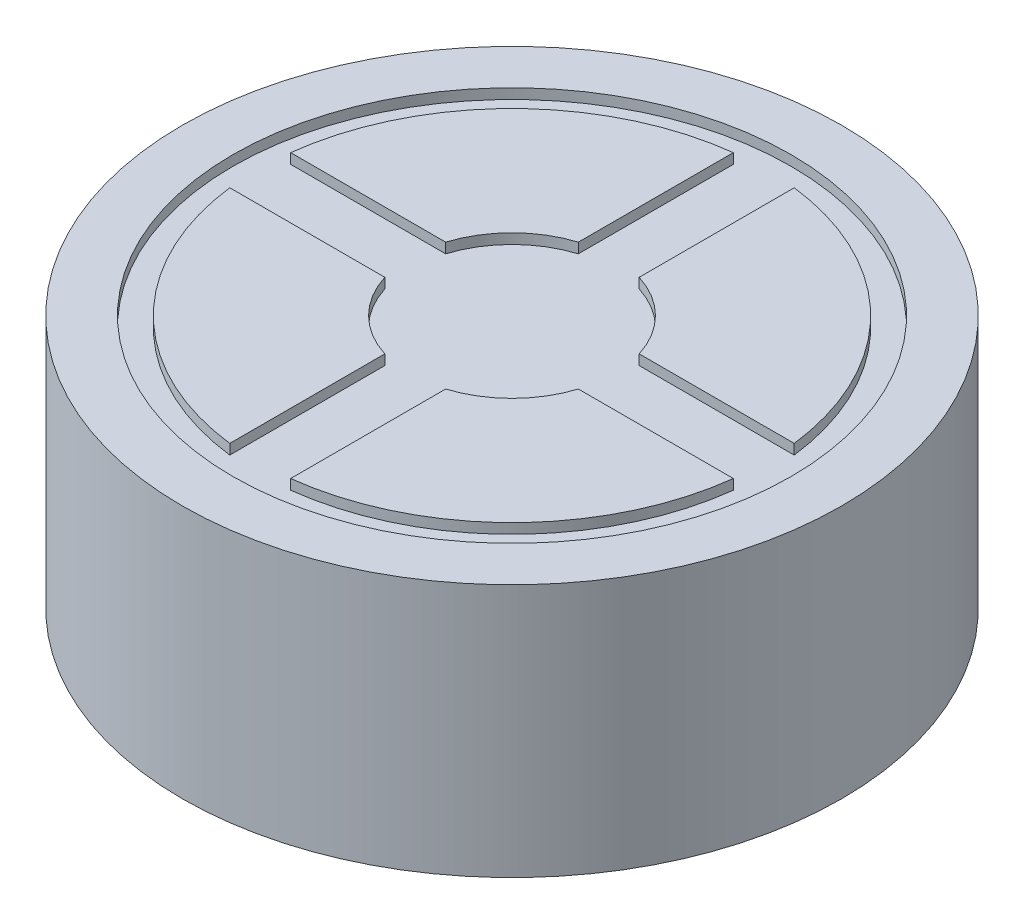
ISO-10303-21;
HEADER;
FILE_DESCRIPTION(('STEP AP214'),'2;1');
FILE_NAME('part.step','',(''),(''),'','','');
FILE_SCHEMA(('AUTOMOTIVE_DESIGN { 1 0 10303 214 1 1 1 1 }'));
ENDSEC;
DATA;
#1=APPLICATION_CONTEXT('core data for automotive mechanical design processes');
#2=APPLICATION_PROTOCOL_DEFINITION('international standard','automotive_design',2000,#1);
#3=PRODUCT_CONTEXT('',#1,'mechanical');
#4=PRODUCT('Part','Part','',(#3));
#5=PRODUCT_RELATED_PRODUCT_CATEGORY('part','',(#4));
#6=PRODUCT_DEFINITION_FORMATION('','',#4);
#7=PRODUCT_DEFINITION_CONTEXT('part definition',#1,'design');
#8=PRODUCT_DEFINITION('design','',#6,#7);
#9=PRODUCT_DEFINITION_SHAPE('','',#8);
#10=(LENGTH_UNIT() NAMED_UNIT(*) SI_UNIT(.MILLI.,.METRE.));
#11=(NAMED_UNIT(*) PLANE_ANGLE_UNIT() SI_UNIT($,.RADIAN.));
#12=(NAMED_UNIT(*) SI_UNIT($,.STERADIAN.) SOLID_ANGLE_UNIT());
#13=UNCERTAINTY_MEASURE_WITH_UNIT(LENGTH_MEASURE(1.E-05),#10,'distance_accuracy_value','');
#14=(GEOMETRIC_REPRESENTATION_CONTEXT(3) GLOBAL_UNCERTAINTY_ASSIGNED_CONTEXT((#13)) GLOBAL_UNIT_ASSIGNED_CONTEXT((#10,
#11,#12)) REPRESENTATION_CONTEXT('',''));
#15=CARTESIAN_POINT('',(0.,0.,0.));
#16=DIRECTION('',(0.,0.,1.));
#17=DIRECTION('',(1.,0.,0.));
#18=AXIS2_PLACEMENT_3D('',#15,#16,#17);
#19=CARTESIAN_POINT('',(0.,5.,0.));
#20=DIRECTION('',(0.,-1.,0.));
#21=DIRECTION('',(0.,0.,-1.));
#22=AXIS2_PLACEMENT_3D('',#19,#20,#21);
#23=CYLINDRICAL_SURFACE('',#22,5.);
#24=CARTESIAN_POINT('',(0.,5.,0.));
#25=DIRECTION('',(0.,1.,0.));
#26=DIRECTION('',(0.,0.,1.));
#27=AXIS2_PLACEMENT_3D('',#24,#25,#26);
#28=CIRCLE('',#27,5.);
#29=CARTESIAN_POINT('',(0.,5.,5.));
#30=VERTEX_POINT('',#29);
#31=EDGE_CURVE('E11',#30,#30,#28,.T.);
#32=ORIENTED_EDGE('',*,*,#31,.F.);
#33=EDGE_LOOP('',(#32));
#34=FACE_BOUND('',#33,.T.);
#35=CARTESIAN_POINT('',(0.,0.,0.));
#36=DIRECTION('',(0.,1.,0.));
#37=DIRECTION('',(0.,0.,1.));
#38=AXIS2_PLACEMENT_3D('',#35,#36,#37);
#39=CIRCLE('',#38,5.);
#40=CARTESIAN_POINT('',(0.,0.,5.));
#41=VERTEX_POINT('',#40);
#42=EDGE_CURVE('E37',#41,#41,#39,.T.);
#43=ORIENTED_EDGE('',*,*,#42,.T.);
#44=EDGE_LOOP('',(#43));
#45=FACE_BOUND('',#44,.T.);
#46=ADVANCED_FACE('F34',(#34,#45),#23,.T.);
#47=CARTESIAN_POINT('',(0.,0.,0.));
#48=DIRECTION('',(0.,1.,0.));
#49=DIRECTION('',(0.,0.,1.));
#50=AXIS2_PLACEMENT_3D('',#47,#48,#49);
#51=PLANE('',#50);
#52=ORIENTED_EDGE('',*,*,#42,.F.);
#53=EDGE_LOOP('',(#52));
#54=FACE_BOUND('',#53,.T.);
#55=ADVANCED_FACE('F318',(#54),#51,.F.);
#56=CARTESIAN_POINT('',(0.,30.,0.));
#57=DIRECTION('',(0.,-1.,0.));
#58=DIRECTION('',(0.,0.,-1.));
#59=AXIS2_PLACEMENT_3D('',#56,#57,#58);
#60=CYLINDRICAL_SURFACE('',#59,32.5);
#61=CARTESIAN_POINT('',(0.,30.,0.));
#62=DIRECTION('',(0.,1.,0.));
#63=DIRECTION('',(0.,0.,1.));
#64=AXIS2_PLACEMENT_3D('',#61,#62,#63);
#65=CIRCLE('',#64,32.5);
#66=CARTESIAN_POINT('',(0.,30.,32.5));
#67=VERTEX_POINT('',#66);
#68=EDGE_CURVE('E292',#67,#67,#65,.T.);
#69=ORIENTED_EDGE('',*,*,#68,.F.);
#70=EDGE_LOOP('',(#69));
#71=FACE_BOUND('',#70,.T.);
#72=CARTESIAN_POINT('',(0.,5.,0.));
#73=DIRECTION('',(0.,1.,0.));
#74=DIRECTION('',(0.,0.,1.));
#75=AXIS2_PLACEMENT_3D('',#72,#73,#74);
#76=CIRCLE('',#75,32.5);
#77=CARTESIAN_POINT('',(0.,5.,32.5));
#78=VERTEX_POINT('',#77);
#79=EDGE_CURVE('E289',#78,#78,#76,.T.);
#80=ORIENTED_EDGE('',*,*,#79,.T.);
#81=EDGE_LOOP('',(#80));
#82=FACE_BOUND('',#81,.T.);
#83=ADVANCED_FACE('F298',(#71,#82),#60,.T.);
#84=CARTESIAN_POINT('',(0.,30.,0.));
#85=DIRECTION('',(0.,1.,0.));
#86=DIRECTION('',(0.,0.,1.));
#87=AXIS2_PLACEMENT_3D('',#84,#85,#86);
#88=PLANE('',#87);
#89=CARTESIAN_POINT('',(0.,30.,0.));
#90=DIRECTION('',(0.,1.,0.));
#91=DIRECTION('',(0.,0.,1.));
#92=AXIS2_PLACEMENT_3D('',#89,#90,#91);
#93=CIRCLE('',#92,27.5);
#94=CARTESIAN_POINT('',(0.,30.,27.5));
#95=VERTEX_POINT('',#94);
#96=EDGE_CURVE('E280',#95,#95,#93,.T.);
#97=ORIENTED_EDGE('',*,*,#96,.F.);
#98=EDGE_LOOP('',(#97));
#99=FACE_BOUND('',#98,.T.);
#100=ORIENTED_EDGE('',*,*,#68,.T.);
#101=EDGE_LOOP('',(#100));
#102=FACE_BOUND('',#101,.T.);
#103=ADVANCED_FACE('F303',(#99,#102),#88,.T.);
#104=CARTESIAN_POINT('',(0.,5.,0.));
#105=DIRECTION('',(0.,1.,0.));
#106=DIRECTION('',(0.,0.,1.));
#107=AXIS2_PLACEMENT_3D('',#104,#105,#106);
#108=PLANE('',#107);
#109=ORIENTED_EDGE('',*,*,#31,.T.);
#110=EDGE_LOOP('',(#109));
#111=FACE_BOUND('',#110,.T.);
#112=ORIENTED_EDGE('',*,*,#79,.F.);
#113=EDGE_LOOP('',(#112));
#114=FACE_BOUND('',#113,.T.);
#115=ADVANCED_FACE('F300',(#111,#114),#108,.F.);
#116=CARTESIAN_POINT('',(0.,29.,0.));
#117=DIRECTION('',(0.,1.,0.));
#118=DIRECTION('',(0.,0.,1.));
#119=AXIS2_PLACEMENT_3D('',#116,#117,#118);
#120=CYLINDRICAL_SURFACE('',#119,27.5);
#121=CARTESIAN_POINT('',(0.,29.,0.));
#122=DIRECTION('',(0.,1.,0.));
#123=DIRECTION('',(0.,0.,1.));
#124=AXIS2_PLACEMENT_3D('',#121,#122,#123);
#125=CIRCLE('',#124,27.5);
#126=CARTESIAN_POINT('',(0.,29.,27.5));
#127=VERTEX_POINT('',#126);
#128=EDGE_CURVE('E286',#127,#127,#125,.T.);
#129=ORIENTED_EDGE('',*,*,#128,.F.);
#130=EDGE_LOOP('',(#129));
#131=FACE_BOUND('',#130,.T.);
#132=ORIENTED_EDGE('',*,*,#96,.T.);
#133=EDGE_LOOP('',(#132));
#134=FACE_BOUND('',#133,.T.);
#135=ADVANCED_FACE('F302',(#131,#134),#120,.F.);
#136=CARTESIAN_POINT('',(0.,29.,0.));
#137=DIRECTION('',(0.,1.,0.));
#138=DIRECTION('',(0.,0.,1.));
#139=AXIS2_PLACEMENT_3D('',#136,#137,#138);
#140=PLANE('',#139);
#141=DIRECTION('',(1.,0.,0.));
#142=VECTOR('',#141,1.);
#143=CARTESIAN_POINT('',(9.53939201416946,29.,-3.));
#144=LINE('',#143,#142);
#145=CARTESIAN_POINT('',(9.53939201416945,29.,-3.));
#146=VERTEX_POINT('',#145);
#147=CARTESIAN_POINT('',(24.8193472919817,29.,-3.));
#148=VERTEX_POINT('',#147);
#149=EDGE_CURVE('E160',#146,#148,#144,.T.);
#150=ORIENTED_EDGE('',*,*,#149,.F.);
#151=CARTESIAN_POINT('',(0.,29.,0.));
#152=DIRECTION('',(0.,-1.,0.));
#153=DIRECTION('',(0.,0.,1.));
#154=AXIS2_PLACEMENT_3D('',#151,#152,#153);
#155=CIRCLE('',#154,10.);
#156=CARTESIAN_POINT('',(3.,29.,-9.53939201416946));
#157=VERTEX_POINT('',#156);
#158=EDGE_CURVE('E170',#157,#146,#155,.T.);
#159=ORIENTED_EDGE('',*,*,#158,.F.);
#160=DIRECTION('',(0.,0.,1.));
#161=VECTOR('',#160,1.);
#162=CARTESIAN_POINT('',(3.,29.,-24.8193472919817));
#163=LINE('',#162,#161);
#164=CARTESIAN_POINT('',(3.,29.,-24.8193472919817));
#165=VERTEX_POINT('',#164);
#166=EDGE_CURVE('E152',#165,#157,#163,.T.);
#167=ORIENTED_EDGE('',*,*,#166,.F.);
#168=CARTESIAN_POINT('',(0.,29.,0.));
#169=DIRECTION('',(0.,1.,0.));
#170=DIRECTION('',(0.,0.,1.));
#171=AXIS2_PLACEMENT_3D('',#168,#169,#170);
#172=CIRCLE('',#171,25.);
#173=EDGE_CURVE('E167',#148,#165,#172,.T.);
#174=ORIENTED_EDGE('',*,*,#173,.F.);
#175=EDGE_LOOP('',(#150,#159,#167,#174));
#176=FACE_BOUND('',#175,.T.);
#177=DIRECTION('',(0.,0.,1.));
#178=VECTOR('',#177,1.);
#179=CARTESIAN_POINT('',(3.,29.,9.53939201416946));
#180=LINE('',#179,#178);
#181=CARTESIAN_POINT('',(3.,29.,9.53939201416946));
#182=VERTEX_POINT('',#181);
#183=CARTESIAN_POINT('',(3.,29.,24.8193472919817));
#184=VERTEX_POINT('',#183);
#185=EDGE_CURVE('E203',#182,#184,#180,.T.);
#186=ORIENTED_EDGE('',*,*,#185,.F.);
#187=CARTESIAN_POINT('',(0.,29.,0.));
#188=DIRECTION('',(0.,-1.,0.));
#189=DIRECTION('',(0.,0.,1.));
#190=AXIS2_PLACEMENT_3D('',#187,#188,#189);
#191=CIRCLE('',#190,10.);
#192=CARTESIAN_POINT('',(9.53939201416946,29.,3.));
#193=VERTEX_POINT('',#192);
#194=EDGE_CURVE('E200',#193,#182,#191,.T.);
#195=ORIENTED_EDGE('',*,*,#194,.F.);
#196=DIRECTION('',(-1.,0.,0.));
#197=VECTOR('',#196,1.);
#198=CARTESIAN_POINT('',(9.53939201416946,29.,3.));
#199=LINE('',#198,#197);
#200=CARTESIAN_POINT('',(24.8193472919817,29.,3.));
#201=VERTEX_POINT('',#200);
#202=EDGE_CURVE('E196',#201,#193,#199,.T.);
#203=ORIENTED_EDGE('',*,*,#202,.F.);
#204=CARTESIAN_POINT('',(0.,29.,0.));
#205=DIRECTION('',(0.,1.,0.));
#206=DIRECTION('',(0.,0.,1.));
#207=AXIS2_PLACEMENT_3D('',#204,#205,#206);
#208=CIRCLE('',#207,25.);
#209=EDGE_CURVE('E193',#184,#201,#208,.T.);
#210=ORIENTED_EDGE('',*,*,#209,.F.);
#211=EDGE_LOOP('',(#186,#195,#203,#210));
#212=FACE_BOUND('',#211,.T.);
#213=DIRECTION('',(0.,0.,-1.));
#214=VECTOR('',#213,1.);
#215=CARTESIAN_POINT('',(-3.,29.,-24.8193472919817));
#216=LINE('',#215,#214);
#217=CARTESIAN_POINT('',(-3.,29.,-9.53939201416946));
#218=VERTEX_POINT('',#217);
#219=CARTESIAN_POINT('',(-3.,29.,-24.8193472919817));
#220=VERTEX_POINT('',#219);
#221=EDGE_CURVE('E236',#218,#220,#216,.T.);
#222=ORIENTED_EDGE('',*,*,#221,.F.);
#223=CARTESIAN_POINT('',(0.,29.,0.));
#224=DIRECTION('',(0.,-1.,0.));
#225=DIRECTION('',(0.,0.,1.));
#226=AXIS2_PLACEMENT_3D('',#223,#224,#225);
#227=CIRCLE('',#226,10.);
#228=CARTESIAN_POINT('',(-9.53939201416946,29.,-3.));
#229=VERTEX_POINT('',#228);
#230=EDGE_CURVE('E233',#229,#218,#227,.T.);
#231=ORIENTED_EDGE('',*,*,#230,.F.);
#232=DIRECTION('',(1.,0.,0.));
#233=VECTOR('',#232,1.);
#234=CARTESIAN_POINT('',(-24.8193472919817,29.,-3.));
#235=LINE('',#234,#233);
#236=CARTESIAN_POINT('',(-24.8193472919817,29.,-3.));
#237=VERTEX_POINT('',#236);
#238=EDGE_CURVE('E229',#237,#229,#235,.T.);
#239=ORIENTED_EDGE('',*,*,#238,.F.);
#240=CARTESIAN_POINT('',(0.,29.,0.));
#241=DIRECTION('',(0.,1.,0.));
#242=DIRECTION('',(0.,0.,1.));
#243=AXIS2_PLACEMENT_3D('',#240,#241,#242);
#244=CIRCLE('',#243,25.);
#245=EDGE_CURVE('E226',#220,#237,#244,.T.);
#246=ORIENTED_EDGE('',*,*,#245,.F.);
#247=EDGE_LOOP('',(#222,#231,#239,#246));
#248=FACE_BOUND('',#247,.T.);
#249=DIRECTION('',(-1.,0.,0.));
#250=VECTOR('',#249,1.);
#251=CARTESIAN_POINT('',(-24.8193472919817,29.,3.));
#252=LINE('',#251,#250);
#253=CARTESIAN_POINT('',(-9.53939201416946,29.,3.));
#254=VERTEX_POINT('',#253);
#255=CARTESIAN_POINT('',(-24.8193472919817,29.,3.));
#256=VERTEX_POINT('',#255);
#257=EDGE_CURVE('E266',#254,#256,#252,.T.);
#258=ORIENTED_EDGE('',*,*,#257,.F.);
#259=CARTESIAN_POINT('',(0.,29.,0.));
#260=DIRECTION('',(0.,-1.,0.));
#261=DIRECTION('',(0.,0.,1.));
#262=AXIS2_PLACEMENT_3D('',#259,#260,#261);
#263=CIRCLE('',#262,10.);
#264=CARTESIAN_POINT('',(-3.,29.,9.53939201416945));
#265=VERTEX_POINT('',#264);
#266=EDGE_CURVE('E263',#265,#254,#263,.T.);
#267=ORIENTED_EDGE('',*,*,#266,.F.);
#268=DIRECTION('',(0.,0.,-1.));
#269=VECTOR('',#268,1.);
#270=CARTESIAN_POINT('',(-3.,29.,9.53939201416946));
#271=LINE('',#270,#269);
#272=CARTESIAN_POINT('',(-3.,29.,24.8193472919817));
#273=VERTEX_POINT('',#272);
#274=EDGE_CURVE('E259',#273,#265,#271,.T.);
#275=ORIENTED_EDGE('',*,*,#274,.F.);
#276=CARTESIAN_POINT('',(0.,29.,0.));
#277=DIRECTION('',(0.,1.,0.));
#278=DIRECTION('',(0.,0.,1.));
#279=AXIS2_PLACEMENT_3D('',#276,#277,#278);
#280=CIRCLE('',#279,25.);
#281=EDGE_CURVE('E256',#256,#273,#280,.T.);
#282=ORIENTED_EDGE('',*,*,#281,.F.);
#283=EDGE_LOOP('',(#258,#267,#275,#282));
#284=FACE_BOUND('',#283,.T.);
#285=ORIENTED_EDGE('',*,*,#128,.T.);
#286=EDGE_LOOP('',(#285));
#287=FACE_BOUND('',#286,.T.);
#288=ADVANCED_FACE('F165',(#176,#212,#248,#284,#287),#140,.T.);
#289=CARTESIAN_POINT('',(0.,29.,0.));
#290=DIRECTION('',(0.,1.,0.));
#291=DIRECTION('',(0.,0.,1.));
#292=AXIS2_PLACEMENT_3D('',#289,#290,#291);
#293=CYLINDRICAL_SURFACE('',#292,25.);
#294=CARTESIAN_POINT('',(0.,30.,0.));
#295=DIRECTION('',(0.,1.,0.));
#296=DIRECTION('',(0.,0.,1.));
#297=AXIS2_PLACEMENT_3D('',#294,#295,#296);
#298=CIRCLE('',#297,25.);
#299=CARTESIAN_POINT('',(-24.8193472919817,30.,3.));
#300=VERTEX_POINT('',#299);
#301=CARTESIAN_POINT('',(-3.,30.,24.8193472919817));
#302=VERTEX_POINT('',#301);
#303=EDGE_CURVE('E250',#300,#302,#298,.T.);
#304=ORIENTED_EDGE('',*,*,#303,.F.);
#305=DIRECTION('',(0.,1.,0.));
#306=VECTOR('',#305,1.);
#307=CARTESIAN_POINT('',(-24.8193472919817,29.,3.));
#308=LINE('',#307,#306);
#309=EDGE_CURVE('E278',#256,#300,#308,.T.);
#310=ORIENTED_EDGE('',*,*,#309,.F.);
#311=ORIENTED_EDGE('',*,*,#281,.T.);
#312=DIRECTION('',(0.,1.,0.));
#313=VECTOR('',#312,1.);
#314=CARTESIAN_POINT('',(-3.,29.,24.8193472919817));
#315=LINE('',#314,#313);
#316=EDGE_CURVE('E269',#273,#302,#315,.T.);
#317=ORIENTED_EDGE('',*,*,#316,.T.);
#318=EDGE_LOOP('',(#304,#310,#311,#317));
#319=FACE_BOUND('',#318,.T.);
#320=ADVANCED_FACE('F360',(#319),#293,.T.);
#321=CARTESIAN_POINT('',(-24.8193472919817,29.,3.));
#322=DIRECTION('',(0.,0.,-1.));
#323=DIRECTION('',(-1.,0.,0.));
#324=AXIS2_PLACEMENT_3D('',#321,#322,#323);
#325=PLANE('',#324);
#326=DIRECTION('',(-1.,0.,0.));
#327=VECTOR('',#326,1.);
#328=CARTESIAN_POINT('',(-24.8193472919817,30.,3.));
#329=LINE('',#328,#327);
#330=CARTESIAN_POINT('',(-9.53939201416946,30.,3.));
#331=VERTEX_POINT('',#330);
#332=EDGE_CURVE('E260',#331,#300,#329,.T.);
#333=ORIENTED_EDGE('',*,*,#332,.F.);
#334=DIRECTION('',(0.,1.,0.));
#335=VECTOR('',#334,1.);
#336=CARTESIAN_POINT('',(-9.53939201416946,29.,3.));
#337=LINE('',#336,#335);
#338=EDGE_CURVE('E281',#254,#331,#337,.T.);
#339=ORIENTED_EDGE('',*,*,#338,.F.);
#340=ORIENTED_EDGE('',*,*,#257,.T.);
#341=ORIENTED_EDGE('',*,*,#309,.T.);
#342=EDGE_LOOP('',(#333,#339,#340,#341));
#343=FACE_BOUND('',#342,.T.);
#344=ADVANCED_FACE('F369',(#343),#325,.T.);
#345=CARTESIAN_POINT('',(0.,29.,0.));
#346=DIRECTION('',(0.,1.,0.));
#347=DIRECTION('',(0.,0.,1.));
#348=AXIS2_PLACEMENT_3D('',#345,#346,#347);
#349=CYLINDRICAL_SURFACE('',#348,10.);
#350=CARTESIAN_POINT('',(0.,30.,0.));
#351=DIRECTION('',(0.,-1.,0.));
#352=DIRECTION('',(0.,0.,1.));
#353=AXIS2_PLACEMENT_3D('',#350,#351,#352);
#354=CIRCLE('',#353,10.);
#355=CARTESIAN_POINT('',(-3.,30.,9.53939201416945));
#356=VERTEX_POINT('',#355);
#357=EDGE_CURVE('E48',#356,#331,#354,.T.);
#358=ORIENTED_EDGE('',*,*,#357,.F.);
#359=DIRECTION('',(0.,1.,0.));
#360=VECTOR('',#359,1.);
#361=CARTESIAN_POINT('',(-3.,29.,9.53939201416945));
#362=LINE('',#361,#360);
#363=EDGE_CURVE('E283',#265,#356,#362,.T.);
#364=ORIENTED_EDGE('',*,*,#363,.F.);
#365=ORIENTED_EDGE('',*,*,#266,.T.);
#366=ORIENTED_EDGE('',*,*,#338,.T.);
#367=EDGE_LOOP('',(#358,#364,#365,#366));
#368=FACE_BOUND('',#367,.T.);
#369=ADVANCED_FACE('F379',(#368),#349,.F.);
#370=CARTESIAN_POINT('',(-3.,29.,9.53939201416946));
#371=DIRECTION('',(1.,0.,0.));
#372=DIRECTION('',(0.,0.,-1.));
#373=AXIS2_PLACEMENT_3D('',#370,#371,#372);
#374=PLANE('',#373);
#375=DIRECTION('',(0.,0.,-1.));
#376=VECTOR('',#375,1.);
#377=CARTESIAN_POINT('',(-3.,30.,9.53939201416946));
#378=LINE('',#377,#376);
#379=EDGE_CURVE('E272',#302,#356,#378,.T.);
#380=ORIENTED_EDGE('',*,*,#379,.F.);
#381=ORIENTED_EDGE('',*,*,#316,.F.);
#382=ORIENTED_EDGE('',*,*,#274,.T.);
#383=ORIENTED_EDGE('',*,*,#363,.T.);
#384=EDGE_LOOP('',(#380,#381,#382,#383));
#385=FACE_BOUND('',#384,.T.);
#386=ADVANCED_FACE('F389',(#385),#374,.T.);
#387=CARTESIAN_POINT('',(0.,29.,0.));
#388=DIRECTION('',(0.,1.,0.));
#389=DIRECTION('',(0.,0.,1.));
#390=AXIS2_PLACEMENT_3D('',#387,#388,#389);
#391=CYLINDRICAL_SURFACE('',#390,25.);
#392=CARTESIAN_POINT('',(0.,30.,0.));
#393=DIRECTION('',(0.,1.,0.));
#394=DIRECTION('',(0.,0.,1.));
#395=AXIS2_PLACEMENT_3D('',#392,#393,#394);
#396=CIRCLE('',#395,25.);
#397=CARTESIAN_POINT('',(-3.,30.,-24.8193472919817));
#398=VERTEX_POINT('',#397);
#399=CARTESIAN_POINT('',(-24.8193472919817,30.,-3.));
#400=VERTEX_POINT('',#399);
#401=EDGE_CURVE('E219',#398,#400,#396,.T.);
#402=ORIENTED_EDGE('',*,*,#401,.F.);
#403=DIRECTION('',(0.,1.,0.));
#404=VECTOR('',#403,1.);
#405=CARTESIAN_POINT('',(-3.,29.,-24.8193472919817));
#406=LINE('',#405,#404);
#407=EDGE_CURVE('E248',#220,#398,#406,.T.);
#408=ORIENTED_EDGE('',*,*,#407,.F.);
#409=ORIENTED_EDGE('',*,*,#245,.T.);
#410=DIRECTION('',(0.,1.,0.));
#411=VECTOR('',#410,1.);
#412=CARTESIAN_POINT('',(-24.8193472919817,29.,-3.));
#413=LINE('',#412,#411);
#414=EDGE_CURVE('E239',#237,#400,#413,.T.);
#415=ORIENTED_EDGE('',*,*,#414,.T.);
#416=EDGE_LOOP('',(#402,#408,#409,#415));
#417=FACE_BOUND('',#416,.T.);
#418=ADVANCED_FACE('F398',(#417),#391,.T.);
#419=CARTESIAN_POINT('',(-3.,29.,-24.8193472919817));
#420=DIRECTION('',(1.,0.,0.));
#421=DIRECTION('',(0.,0.,-1.));
#422=AXIS2_PLACEMENT_3D('',#419,#420,#421);
#423=PLANE('',#422);
#424=DIRECTION('',(0.,0.,-1.));
#425=VECTOR('',#424,1.);
#426=CARTESIAN_POINT('',(-3.,30.,-24.8193472919817));
#427=LINE('',#426,#425);
#428=CARTESIAN_POINT('',(-3.,30.,-9.53939201416946));
#429=VERTEX_POINT('',#428);
#430=EDGE_CURVE('E230',#429,#398,#427,.T.);
#431=ORIENTED_EDGE('',*,*,#430,.F.);
#432=DIRECTION('',(0.,1.,0.));
#433=VECTOR('',#432,1.);
#434=CARTESIAN_POINT('',(-3.,29.,-9.53939201416946));
#435=LINE('',#434,#433);
#436=EDGE_CURVE('E251',#218,#429,#435,.T.);
#437=ORIENTED_EDGE('',*,*,#436,.F.);
#438=ORIENTED_EDGE('',*,*,#221,.T.);
#439=ORIENTED_EDGE('',*,*,#407,.T.);
#440=EDGE_LOOP('',(#431,#437,#438,#439));
#441=FACE_BOUND('',#440,.T.);
#442=ADVANCED_FACE('F408',(#441),#423,.T.);
#443=CARTESIAN_POINT('',(0.,29.,0.));
#444=DIRECTION('',(0.,1.,0.));
#445=DIRECTION('',(0.,0.,1.));
#446=AXIS2_PLACEMENT_3D('',#443,#444,#445);
#447=CYLINDRICAL_SURFACE('',#446,10.);
#448=CARTESIAN_POINT('',(0.,30.,0.));
#449=DIRECTION('',(0.,-1.,0.));
#450=DIRECTION('',(0.,0.,1.));
#451=AXIS2_PLACEMENT_3D('',#448,#449,#450);
#452=CIRCLE('',#451,10.);
#453=CARTESIAN_POINT('',(-9.53939201416946,30.,-3.));
#454=VERTEX_POINT('',#453);
#455=EDGE_CURVE('E56',#454,#429,#452,.T.);
#456=ORIENTED_EDGE('',*,*,#455,.F.);
#457=DIRECTION('',(0.,1.,0.));
#458=VECTOR('',#457,1.);
#459=CARTESIAN_POINT('',(-9.53939201416946,29.,-3.));
#460=LINE('',#459,#458);
#461=EDGE_CURVE('E253',#229,#454,#460,.T.);
#462=ORIENTED_EDGE('',*,*,#461,.F.);
#463=ORIENTED_EDGE('',*,*,#230,.T.);
#464=ORIENTED_EDGE('',*,*,#436,.T.);
#465=EDGE_LOOP('',(#456,#462,#463,#464));
#466=FACE_BOUND('',#465,.T.);
#467=ADVANCED_FACE('F418',(#466),#447,.F.);
#468=CARTESIAN_POINT('',(-24.8193472919817,29.,-3.));
#469=DIRECTION('',(0.,0.,1.));
#470=DIRECTION('',(1.,0.,0.));
#471=AXIS2_PLACEMENT_3D('',#468,#469,#470);
#472=PLANE('',#471);
#473=DIRECTION('',(1.,0.,0.));
#474=VECTOR('',#473,1.);
#475=CARTESIAN_POINT('',(-24.8193472919817,30.,-3.));
#476=LINE('',#475,#474);
#477=EDGE_CURVE('E242',#400,#454,#476,.T.);
#478=ORIENTED_EDGE('',*,*,#477,.F.);
#479=ORIENTED_EDGE('',*,*,#414,.F.);
#480=ORIENTED_EDGE('',*,*,#238,.T.);
#481=ORIENTED_EDGE('',*,*,#461,.T.);
#482=EDGE_LOOP('',(#478,#479,#480,#481));
#483=FACE_BOUND('',#482,.T.);
#484=ADVANCED_FACE('F428',(#483),#472,.T.);
#485=CARTESIAN_POINT('',(0.,29.,0.));
#486=DIRECTION('',(0.,1.,0.));
#487=DIRECTION('',(0.,0.,1.));
#488=AXIS2_PLACEMENT_3D('',#485,#486,#487);
#489=CYLINDRICAL_SURFACE('',#488,25.);
#490=CARTESIAN_POINT('',(0.,30.,0.));
#491=DIRECTION('',(0.,1.,0.));
#492=DIRECTION('',(0.,0.,1.));
#493=AXIS2_PLACEMENT_3D('',#490,#491,#492);
#494=CIRCLE('',#493,25.);
#495=CARTESIAN_POINT('',(3.,30.,24.8193472919817));
#496=VERTEX_POINT('',#495);
#497=CARTESIAN_POINT('',(24.8193472919817,30.,3.));
#498=VERTEX_POINT('',#497);
#499=EDGE_CURVE('E189',#496,#498,#494,.T.);
#500=ORIENTED_EDGE('',*,*,#499,.F.);
#501=DIRECTION('',(0.,1.,0.));
#502=VECTOR('',#501,1.);
#503=CARTESIAN_POINT('',(3.,29.,24.8193472919817));
#504=LINE('',#503,#502);
#505=EDGE_CURVE('E217',#184,#496,#504,.T.);
#506=ORIENTED_EDGE('',*,*,#505,.F.);
#507=ORIENTED_EDGE('',*,*,#209,.T.);
#508=DIRECTION('',(0.,1.,0.));
#509=VECTOR('',#508,1.);
#510=CARTESIAN_POINT('',(24.8193472919817,29.,3.));
#511=LINE('',#510,#509);
#512=EDGE_CURVE('E206',#201,#498,#511,.T.);
#513=ORIENTED_EDGE('',*,*,#512,.T.);
#514=EDGE_LOOP('',(#500,#506,#507,#513));
#515=FACE_BOUND('',#514,.T.);
#516=ADVANCED_FACE('F437',(#515),#489,.T.);
#517=CARTESIAN_POINT('',(3.,29.,9.53939201416946));
#518=DIRECTION('',(-1.,0.,0.));
#519=DIRECTION('',(0.,0.,1.));
#520=AXIS2_PLACEMENT_3D('',#517,#518,#519);
#521=PLANE('',#520);
#522=DIRECTION('',(0.,0.,1.));
#523=VECTOR('',#522,1.);
#524=CARTESIAN_POINT('',(3.,30.,9.53939201416946));
#525=LINE('',#524,#523);
#526=CARTESIAN_POINT('',(3.,30.,9.53939201416946));
#527=VERTEX_POINT('',#526);
#528=EDGE_CURVE('E197',#527,#496,#525,.T.);
#529=ORIENTED_EDGE('',*,*,#528,.F.);
#530=DIRECTION('',(0.,1.,0.));
#531=VECTOR('',#530,1.);
#532=CARTESIAN_POINT('',(3.,29.,9.53939201416946));
#533=LINE('',#532,#531);
#534=EDGE_CURVE('E220',#182,#527,#533,.T.);
#535=ORIENTED_EDGE('',*,*,#534,.F.);
#536=ORIENTED_EDGE('',*,*,#185,.T.);
#537=ORIENTED_EDGE('',*,*,#505,.T.);
#538=EDGE_LOOP('',(#529,#535,#536,#537));
#539=FACE_BOUND('',#538,.T.);
#540=ADVANCED_FACE('F447',(#539),#521,.T.);
#541=CARTESIAN_POINT('',(0.,29.,0.));
#542=DIRECTION('',(0.,1.,0.));
#543=DIRECTION('',(0.,0.,1.));
#544=AXIS2_PLACEMENT_3D('',#541,#542,#543);
#545=CYLINDRICAL_SURFACE('',#544,10.);
#546=CARTESIAN_POINT('',(0.,30.,0.));
#547=DIRECTION('',(0.,-1.,0.));
#548=DIRECTION('',(0.,0.,1.));
#549=AXIS2_PLACEMENT_3D('',#546,#547,#548);
#550=CIRCLE('',#549,10.);
#551=CARTESIAN_POINT('',(9.53939201416946,30.,3.));
#552=VERTEX_POINT('',#551);
#553=EDGE_CURVE('E212',#552,#527,#550,.T.);
#554=ORIENTED_EDGE('',*,*,#553,.F.);
#555=DIRECTION('',(0.,1.,0.));
#556=VECTOR('',#555,1.);
#557=CARTESIAN_POINT('',(9.53939201416946,29.,3.));
#558=LINE('',#557,#556);
#559=EDGE_CURVE('E222',#193,#552,#558,.T.);
#560=ORIENTED_EDGE('',*,*,#559,.F.);
#561=ORIENTED_EDGE('',*,*,#194,.T.);
#562=ORIENTED_EDGE('',*,*,#534,.T.);
#563=EDGE_LOOP('',(#554,#560,#561,#562));
#564=FACE_BOUND('',#563,.T.);
#565=ADVANCED_FACE('F457',(#564),#545,.F.);
#566=CARTESIAN_POINT('',(9.53939201416946,29.,3.));
#567=DIRECTION('',(0.,0.,-1.));
#568=DIRECTION('',(-1.,0.,0.));
#569=AXIS2_PLACEMENT_3D('',#566,#567,#568);
#570=PLANE('',#569);
#571=DIRECTION('',(-1.,0.,0.));
#572=VECTOR('',#571,1.);
#573=CARTESIAN_POINT('',(9.53939201416946,30.,3.));
#574=LINE('',#573,#572);
#575=EDGE_CURVE('E209',#498,#552,#574,.T.);
#576=ORIENTED_EDGE('',*,*,#575,.F.);
#577=ORIENTED_EDGE('',*,*,#512,.F.);
#578=ORIENTED_EDGE('',*,*,#202,.T.);
#579=ORIENTED_EDGE('',*,*,#559,.T.);
#580=EDGE_LOOP('',(#576,#577,#578,#579));
#581=FACE_BOUND('',#580,.T.);
#582=ADVANCED_FACE('F467',(#581),#570,.T.);
#583=CARTESIAN_POINT('',(0.,29.,0.));
#584=DIRECTION('',(0.,1.,0.));
#585=DIRECTION('',(0.,0.,1.));
#586=AXIS2_PLACEMENT_3D('',#583,#584,#585);
#587=CYLINDRICAL_SURFACE('',#586,25.);
#588=CARTESIAN_POINT('',(0.,30.,0.));
#589=DIRECTION('',(0.,1.,0.));
#590=DIRECTION('',(0.,0.,1.));
#591=AXIS2_PLACEMENT_3D('',#588,#589,#590);
#592=CIRCLE('',#591,25.);
#593=CARTESIAN_POINT('',(24.8193472919817,30.,-3.));
#594=VERTEX_POINT('',#593);
#595=CARTESIAN_POINT('',(3.,30.,-24.8193472919817));
#596=VERTEX_POINT('',#595);
#597=EDGE_CURVE('E183',#594,#596,#592,.T.);
#598=ORIENTED_EDGE('',*,*,#597,.F.);
#599=DIRECTION('',(0.,1.,0.));
#600=VECTOR('',#599,1.);
#601=CARTESIAN_POINT('',(24.8193472919817,29.,-3.));
#602=LINE('',#601,#600);
#603=EDGE_CURVE('E174',#148,#594,#602,.T.);
#604=ORIENTED_EDGE('',*,*,#603,.F.);
#605=ORIENTED_EDGE('',*,*,#173,.T.);
#606=DIRECTION('',(0.,1.,0.));
#607=VECTOR('',#606,1.);
#608=CARTESIAN_POINT('',(3.,29.,-24.8193472919817));
#609=LINE('',#608,#607);
#610=EDGE_CURVE('E148',#165,#596,#609,.T.);
#611=ORIENTED_EDGE('',*,*,#610,.T.);
#612=EDGE_LOOP('',(#598,#604,#605,#611));
#613=FACE_BOUND('',#612,.T.);
#614=ADVANCED_FACE('F173',(#613),#587,.T.);
#615=CARTESIAN_POINT('',(9.53939201416946,29.,-3.));
#616=DIRECTION('',(0.,0.,1.));
#617=DIRECTION('',(1.,0.,0.));
#618=AXIS2_PLACEMENT_3D('',#615,#616,#617);
#619=PLANE('',#618);
#620=DIRECTION('',(1.,0.,0.));
#621=VECTOR('',#620,1.);
#622=CARTESIAN_POINT('',(9.53939201416946,30.,-3.));
#623=LINE('',#622,#621);
#624=CARTESIAN_POINT('',(9.53939201416945,30.,-3.));
#625=VERTEX_POINT('',#624);
#626=EDGE_CURVE('E175',#625,#594,#623,.T.);
#627=ORIENTED_EDGE('',*,*,#626,.F.);
#628=DIRECTION('',(0.,1.,0.));
#629=VECTOR('',#628,1.);
#630=CARTESIAN_POINT('',(9.53939201416945,29.,-3.));
#631=LINE('',#630,#629);
#632=EDGE_CURVE('E190',#146,#625,#631,.T.);
#633=ORIENTED_EDGE('',*,*,#632,.F.);
#634=ORIENTED_EDGE('',*,*,#149,.T.);
#635=ORIENTED_EDGE('',*,*,#603,.T.);
#636=EDGE_LOOP('',(#627,#633,#634,#635));
#637=FACE_BOUND('',#636,.T.);
#638=ADVANCED_FACE('F486',(#637),#619,.T.);
#639=CARTESIAN_POINT('',(0.,29.,0.));
#640=DIRECTION('',(0.,1.,0.));
#641=DIRECTION('',(0.,0.,1.));
#642=AXIS2_PLACEMENT_3D('',#639,#640,#641);
#643=CYLINDRICAL_SURFACE('',#642,10.);
#644=CARTESIAN_POINT('',(0.,30.,0.));
#645=DIRECTION('',(0.,-1.,0.));
#646=DIRECTION('',(0.,0.,1.));
#647=AXIS2_PLACEMENT_3D('',#644,#645,#646);
#648=CIRCLE('',#647,10.);
#649=CARTESIAN_POINT('',(3.,30.,-9.53939201416946));
#650=VERTEX_POINT('',#649);
#651=EDGE_CURVE('E178',#650,#625,#648,.T.);
#652=ORIENTED_EDGE('',*,*,#651,.F.);
#653=DIRECTION('',(0.,1.,0.));
#654=VECTOR('',#653,1.);
#655=CARTESIAN_POINT('',(3.,29.,-9.53939201416946));
#656=LINE('',#655,#654);
#657=EDGE_CURVE('E159',#157,#650,#656,.T.);
#658=ORIENTED_EDGE('',*,*,#657,.F.);
#659=ORIENTED_EDGE('',*,*,#158,.T.);
#660=ORIENTED_EDGE('',*,*,#632,.T.);
#661=EDGE_LOOP('',(#652,#658,#659,#660));
#662=FACE_BOUND('',#661,.T.);
#663=ADVANCED_FACE('F495',(#662),#643,.F.);
#664=CARTESIAN_POINT('',(3.,29.,-24.8193472919817));
#665=DIRECTION('',(-1.,0.,0.));
#666=DIRECTION('',(0.,0.,1.));
#667=AXIS2_PLACEMENT_3D('',#664,#665,#666);
#668=PLANE('',#667);
#669=DIRECTION('',(0.,0.,1.));
#670=VECTOR('',#669,1.);
#671=CARTESIAN_POINT('',(3.,30.,-24.8193472919817));
#672=LINE('',#671,#670);
#673=EDGE_CURVE('E154',#596,#650,#672,.T.);
#674=ORIENTED_EDGE('',*,*,#673,.F.);
#675=ORIENTED_EDGE('',*,*,#610,.F.);
#676=ORIENTED_EDGE('',*,*,#166,.T.);
#677=ORIENTED_EDGE('',*,*,#657,.T.);
#678=EDGE_LOOP('',(#674,#675,#676,#677));
#679=FACE_BOUND('',#678,.T.);
#680=ADVANCED_FACE('F150',(#679),#668,.T.);
#681=ORIENTED_EDGE('',*,*,#528,.T.);
#682=ORIENTED_EDGE('',*,*,#499,.T.);
#683=ORIENTED_EDGE('',*,*,#575,.T.);
#684=ORIENTED_EDGE('',*,*,#553,.T.);
#685=EDGE_LOOP('',(#681,#682,#683,#684));
#686=FACE_BOUND('',#685,.T.);
#687=ADVANCED_FACE('F514',(#686),#88,.T.);
#688=ORIENTED_EDGE('',*,*,#430,.T.);
#689=ORIENTED_EDGE('',*,*,#401,.T.);
#690=ORIENTED_EDGE('',*,*,#477,.T.);
#691=ORIENTED_EDGE('',*,*,#455,.T.);
#692=EDGE_LOOP('',(#688,#689,#690,#691));
#693=FACE_BOUND('',#692,.T.);
#694=ADVANCED_FACE('F523',(#693),#88,.T.);
#695=ORIENTED_EDGE('',*,*,#332,.T.);
#696=ORIENTED_EDGE('',*,*,#303,.T.);
#697=ORIENTED_EDGE('',*,*,#379,.T.);
#698=ORIENTED_EDGE('',*,*,#357,.T.);
#699=EDGE_LOOP('',(#695,#696,#697,#698));
#700=FACE_BOUND('',#699,.T.);
#701=ADVANCED_FACE('F314',(#700),#88,.T.);
#702=ORIENTED_EDGE('',*,*,#626,.T.);
#703=ORIENTED_EDGE('',*,*,#597,.T.);
#704=ORIENTED_EDGE('',*,*,#673,.T.);
#705=ORIENTED_EDGE('',*,*,#651,.T.);
#706=EDGE_LOOP('',(#702,#703,#704,#705));
#707=FACE_BOUND('',#706,.T.);
#708=ADVANCED_FACE('F315',(#707),#88,.T.);
#709=CLOSED_SHELL('',(#46,#55,#83,#103,#115,#135,#288,#320,#344,#369,#386,#418,#442,#467,#484,
#516,#540,#565,#582,#614,#638,#663,#680,#687,#694,#701,#708));
#710=MANIFOLD_SOLID_BREP('B2',#709);
#711=ADVANCED_BREP_SHAPE_REPRESENTATION('',(#18,#710),#14);
#712=SHAPE_DEFINITION_REPRESENTATION(#9,#711);
ENDSEC;
END-ISO-10303-21;
